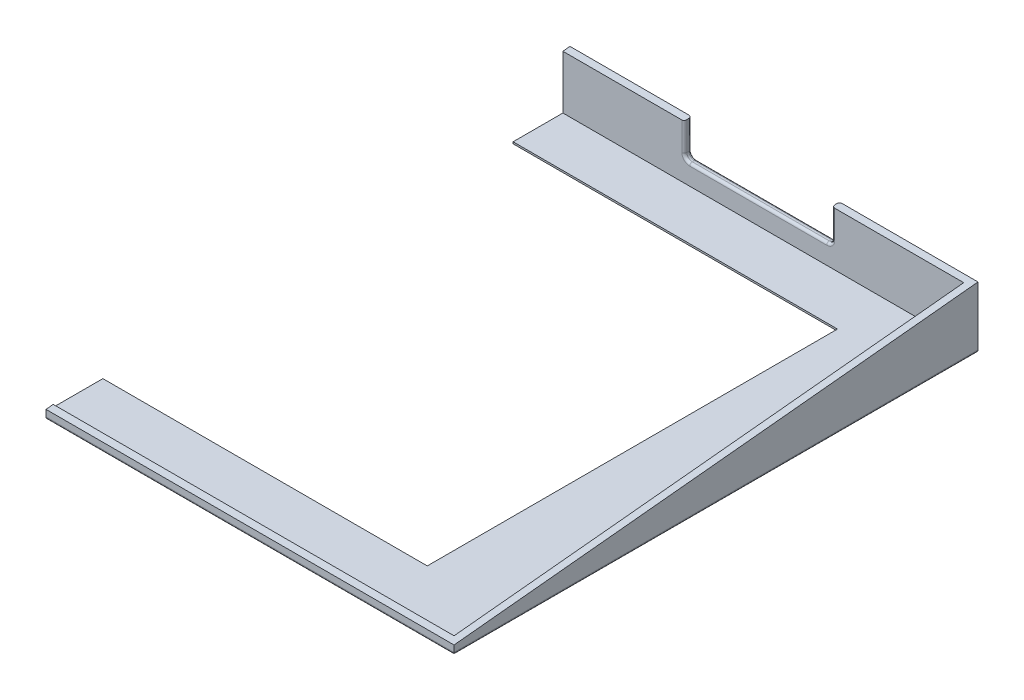
ISO-10303-21;
HEADER;
FILE_DESCRIPTION(('STEP AP214'),'2;1');
FILE_NAME('part.step','',(''),(''),'','','');
FILE_SCHEMA(('AUTOMOTIVE_DESIGN { 1 0 10303 214 1 1 1 1 }'));
ENDSEC;
DATA;
#1=APPLICATION_CONTEXT('core data for automotive mechanical design processes');
#2=APPLICATION_PROTOCOL_DEFINITION('international standard','automotive_design',2000,#1);
#3=PRODUCT_CONTEXT('',#1,'mechanical');
#4=PRODUCT('Part','Part','',(#3));
#5=PRODUCT_RELATED_PRODUCT_CATEGORY('part','',(#4));
#6=PRODUCT_DEFINITION_FORMATION('','',#4);
#7=PRODUCT_DEFINITION_CONTEXT('part definition',#1,'design');
#8=PRODUCT_DEFINITION('design','',#6,#7);
#9=PRODUCT_DEFINITION_SHAPE('','',#8);
#10=(LENGTH_UNIT() NAMED_UNIT(*) SI_UNIT(.MILLI.,.METRE.));
#11=(NAMED_UNIT(*) PLANE_ANGLE_UNIT() SI_UNIT($,.RADIAN.));
#12=(NAMED_UNIT(*) SI_UNIT($,.STERADIAN.) SOLID_ANGLE_UNIT());
#13=UNCERTAINTY_MEASURE_WITH_UNIT(LENGTH_MEASURE(1.E-05),#10,'distance_accuracy_value','');
#14=(GEOMETRIC_REPRESENTATION_CONTEXT(3) GLOBAL_UNCERTAINTY_ASSIGNED_CONTEXT((#13)) GLOBAL_UNIT_ASSIGNED_CONTEXT((#10,
#11,#12)) REPRESENTATION_CONTEXT('',''));
#15=CARTESIAN_POINT('',(0.,0.,0.));
#16=DIRECTION('',(0.,0.,1.));
#17=DIRECTION('',(1.,0.,0.));
#18=AXIS2_PLACEMENT_3D('',#15,#16,#17);
#19=CARTESIAN_POINT('',(0.,0.,0.));
#20=DIRECTION('',(1.,0.,0.));
#21=DIRECTION('',(0.,0.,-1.));
#22=AXIS2_PLACEMENT_3D('',#19,#20,#21);
#23=PLANE('',#22);
#24=DIRECTION('',(0.,-1.,0.));
#25=VECTOR('',#24,1.);
#26=CARTESIAN_POINT('',(0.,-261.583327885194,-70.7189583673774));
#27=LINE('',#26,#25);
#28=CARTESIAN_POINT('',(0.,16.8383329791763,-70.7189583673774));
#29=VERTEX_POINT('',#28);
#30=CARTESIAN_POINT('',(0.,2.,-70.7189583673774));
#31=VERTEX_POINT('',#30);
#32=EDGE_CURVE('E474',#29,#31,#27,.T.);
#33=ORIENTED_EDGE('',*,*,#32,.F.);
#34=DIRECTION('',(0.,-0.0994934181893851,0.995038220239299));
#35=VECTOR('',#34,1.);
#36=CARTESIAN_POINT('',(0.,9.67049186230395,0.966948074338153));
#37=LINE('',#36,#35);
#38=CARTESIAN_POINT('',(0.,17.0343531192115,-72.6793647422029));
#39=VERTEX_POINT('',#38);
#40=EDGE_CURVE('E470',#39,#29,#37,.T.);
#41=ORIENTED_EDGE('',*,*,#40,.F.);
#42=DIRECTION('',(0.,-1.,0.));
#43=VECTOR('',#42,1.);
#44=CARTESIAN_POINT('',(0.,0.,-72.6793647422029));
#45=LINE('',#44,#43);
#46=CARTESIAN_POINT('',(0.,0.7,-72.6793647422029));
#47=VERTEX_POINT('',#46);
#48=EDGE_CURVE('E463',#39,#47,#45,.T.);
#49=ORIENTED_EDGE('',*,*,#48,.T.);
#50=CARTESIAN_POINT('',(0.,0.7,-71.9793647422029));
#51=DIRECTION('',(1.,0.,0.));
#52=DIRECTION('',(0.,0.,-1.));
#53=AXIS2_PLACEMENT_3D('',#50,#51,#52);
#54=CIRCLE('',#53,0.7);
#55=CARTESIAN_POINT('',(0.,0.,-71.9793647422029));
#56=VERTEX_POINT('',#55);
#57=EDGE_CURVE('E97',#47,#56,#54,.F.);
#58=ORIENTED_EDGE('',*,*,#57,.T.);
#59=DIRECTION('',(0.,0.,1.));
#60=VECTOR('',#59,1.);
#61=CARTESIAN_POINT('',(0.,0.,0.));
#62=LINE('',#61,#60);
#63=CARTESIAN_POINT('',(0.,0.,-61.026216129182));
#64=VERTEX_POINT('',#63);
#65=EDGE_CURVE('E466',#56,#64,#62,.T.);
#66=ORIENTED_EDGE('',*,*,#65,.T.);
#67=DIRECTION('',(0.,-0.342020143325668,-0.939692620785909));
#68=VECTOR('',#67,1.);
#69=CARTESIAN_POINT('',(0.,0.,-61.026216129182));
#70=LINE('',#69,#68);
#71=CARTESIAN_POINT('',(0.,1.50000000000002,-56.905));
#72=VERTEX_POINT('',#71);
#73=EDGE_CURVE('E469',#64,#72,#70,.F.);
#74=ORIENTED_EDGE('',*,*,#73,.T.);
#75=DIRECTION('',(0.,1.,0.));
#76=VECTOR('',#75,1.);
#77=CARTESIAN_POINT('',(0.,2.,-56.905));
#78=LINE('',#77,#76);
#79=CARTESIAN_POINT('',(0.,2.,-56.905));
#80=VERTEX_POINT('',#79);
#81=EDGE_CURVE('E92',#72,#80,#78,.T.);
#82=ORIENTED_EDGE('',*,*,#81,.T.);
#83=DIRECTION('',(0.,0.,1.));
#84=VECTOR('',#83,1.);
#85=CARTESIAN_POINT('',(0.,2.,0.));
#86=LINE('',#85,#84);
#87=EDGE_CURVE('E478',#31,#80,#86,.T.);
#88=ORIENTED_EDGE('',*,*,#87,.F.);
#89=EDGE_LOOP('',(#33,#41,#49,#58,#66,#74,#82,#88));
#90=FACE_BOUND('',#89,.T.);
#91=ADVANCED_FACE('F89',(#90),#23,.F.);
#92=DIRECTION('',(0.,-1.,0.));
#93=VECTOR('',#92,1.);
#94=CARTESIAN_POINT('',(0.,2.,56.905));
#95=LINE('',#94,#93);
#96=CARTESIAN_POINT('',(0.,2.,56.905));
#97=VERTEX_POINT('',#96);
#98=CARTESIAN_POINT('',(0.,1.50000000000002,56.905));
#99=VERTEX_POINT('',#98);
#100=EDGE_CURVE('E475',#97,#99,#95,.T.);
#101=ORIENTED_EDGE('',*,*,#100,.T.);
#102=DIRECTION('',(0.,0.342020143325668,-0.939692620785909));
#103=VECTOR('',#102,1.);
#104=CARTESIAN_POINT('',(0.,0.,61.026216129182));
#105=LINE('',#104,#103);
#106=CARTESIAN_POINT('',(0.,0.,61.026216129182));
#107=VERTEX_POINT('',#106);
#108=EDGE_CURVE('E462',#99,#107,#105,.F.);
#109=ORIENTED_EDGE('',*,*,#108,.T.);
#110=CARTESIAN_POINT('',(0.,0.,71.9793647422029));
#111=VERTEX_POINT('',#110);
#112=EDGE_CURVE('E464',#107,#111,#62,.T.);
#113=ORIENTED_EDGE('',*,*,#112,.T.);
#114=CARTESIAN_POINT('',(0.,0.7,71.9793647422029));
#115=DIRECTION('',(1.,0.,0.));
#116=DIRECTION('',(0.,0.,-1.));
#117=AXIS2_PLACEMENT_3D('',#114,#115,#116);
#118=CIRCLE('',#117,0.7);
#119=CARTESIAN_POINT('',(0.,0.7,72.6793647422029));
#120=VERTEX_POINT('',#119);
#121=EDGE_CURVE('E12',#111,#120,#118,.F.);
#122=ORIENTED_EDGE('',*,*,#121,.T.);
#123=DIRECTION('',(0.,1.,0.));
#124=VECTOR('',#123,1.);
#125=CARTESIAN_POINT('',(0.,0.,72.6793647422029));
#126=LINE('',#125,#124);
#127=CARTESIAN_POINT('',(0.,2.5,72.6793647422029));
#128=VERTEX_POINT('',#127);
#129=EDGE_CURVE('E111',#120,#128,#126,.T.);
#130=ORIENTED_EDGE('',*,*,#129,.T.);
#131=CARTESIAN_POINT('',(0.,2.699979088573,70.6793647422029));
#132=VERTEX_POINT('',#131);
#133=EDGE_CURVE('E292',#132,#128,#37,.T.);
#134=ORIENTED_EDGE('',*,*,#133,.F.);
#135=DIRECTION('',(0.,1.,0.));
#136=VECTOR('',#135,1.);
#137=CARTESIAN_POINT('',(0.,-261.583327885194,70.6793647422029));
#138=LINE('',#137,#136);
#139=CARTESIAN_POINT('',(0.,2.,70.6793647422029));
#140=VERTEX_POINT('',#139);
#141=EDGE_CURVE('E472',#140,#132,#138,.T.);
#142=ORIENTED_EDGE('',*,*,#141,.F.);
#143=EDGE_CURVE('E480',#97,#140,#86,.T.);
#144=ORIENTED_EDGE('',*,*,#143,.F.);
#145=EDGE_LOOP('',(#101,#109,#113,#122,#130,#134,#142,#144));
#146=FACE_BOUND('',#145,.T.);
#147=ADVANCED_FACE('F499',(#146),#23,.F.);
#148=CARTESIAN_POINT('',(259.440380786187,9.67049186230395,0.966948074338153));
#149=DIRECTION('',(0.,-0.995038220239299,-0.0994934181893851));
#150=DIRECTION('',(0.,0.0994934181893851,-0.995038220239299));
#151=AXIS2_PLACEMENT_3D('',#148,#149,#150);
#152=PLANE('',#151);
#153=DIRECTION('',(-1.,0.,0.));
#154=VECTOR('',#153,1.);
#155=CARTESIAN_POINT('',(259.440380786187,17.0343531192115,-72.6793647422029));
#156=LINE('',#155,#154);
#157=CARTESIAN_POINT('',(33.0037224637248,17.0343531192115,-72.6793647422029));
#158=VERTEX_POINT('',#157);
#159=EDGE_CURVE('E293',#158,#39,#156,.T.);
#160=ORIENTED_EDGE('',*,*,#159,.T.);
#161=ORIENTED_EDGE('',*,*,#40,.T.);
#162=DIRECTION('',(-1.,0.,0.));
#163=VECTOR('',#162,1.);
#164=CARTESIAN_POINT('',(-111.243316088899,16.8383329791763,-70.7189583673774));
#165=LINE('',#164,#163);
#166=CARTESIAN_POINT('',(33.0037224637248,16.8383329791763,-70.7189583673774));
#167=VERTEX_POINT('',#166);
#168=EDGE_CURVE('E310',#167,#29,#165,.T.);
#169=ORIENTED_EDGE('',*,*,#168,.F.);
#170=CARTESIAN_POINT('',(33.0037224637248,16.9083256601769,-71.4189583673774));
#171=DIRECTION('',(0.,-0.995038220239299,-0.0994934181893851));
#172=DIRECTION('',(0.,-0.0994934181893851,0.995038220239299));
#173=AXIS2_PLACEMENT_3D('',#170,#171,#172);
#174=ELLIPSE('',#173,0.703490565248494,0.7);
#175=CARTESIAN_POINT('',(33.7037224637248,16.9083256601769,-71.4189583673774));
#176=VERTEX_POINT('',#175);
#177=EDGE_CURVE('E372',#167,#176,#174,.F.);
#178=ORIENTED_EDGE('',*,*,#177,.T.);
#179=DIRECTION('',(0.,0.0994934181893851,-0.995038220239299));
#180=VECTOR('',#179,1.);
#181=CARTESIAN_POINT('',(33.7037224637248,9.67049186230395,0.966948074338153));
#182=LINE('',#181,#180);
#183=CARTESIAN_POINT('',(33.7037224637248,16.9643604382109,-71.9793647422029));
#184=VERTEX_POINT('',#183);
#185=EDGE_CURVE('E344',#176,#184,#182,.T.);
#186=ORIENTED_EDGE('',*,*,#185,.T.);
#187=CARTESIAN_POINT('',(33.0037224637248,16.9643604382109,-71.9793647422029));
#188=DIRECTION('',(0.,-0.995038220239299,-0.0994934181893851));
#189=DIRECTION('',(0.,-0.0994934181893851,0.995038220239299));
#190=AXIS2_PLACEMENT_3D('',#187,#188,#189);
#191=ELLIPSE('',#190,0.703490565248494,0.7);
#192=EDGE_CURVE('E370',#184,#158,#191,.F.);
#193=ORIENTED_EDGE('',*,*,#192,.T.);
#194=EDGE_LOOP('',(#160,#161,#169,#178,#186,#193));
#195=FACE_BOUND('',#194,.T.);
#196=ADVANCED_FACE('F539',(#195),#152,.F.);
#197=CARTESIAN_POINT('',(0.,2.,0.));
#198=DIRECTION('',(0.,-1.,0.));
#199=DIRECTION('',(0.,0.,-1.));
#200=AXIS2_PLACEMENT_3D('',#197,#198,#199);
#201=PLANE('',#200);
#202=DIRECTION('',(-1.,0.,0.));
#203=VECTOR('',#202,1.);
#204=CARTESIAN_POINT('',(-111.243316088899,2.,-70.7189583673774));
#205=LINE('',#204,#203);
#206=CARTESIAN_POINT('',(111.203722463725,2.,-70.7189583673774));
#207=VERTEX_POINT('',#206);
#208=EDGE_CURVE('E314',#207,#31,#205,.T.);
#209=ORIENTED_EDGE('',*,*,#208,.T.);
#210=ORIENTED_EDGE('',*,*,#87,.T.);
#211=DIRECTION('',(-1.,0.,0.));
#212=VECTOR('',#211,1.);
#213=CARTESIAN_POINT('',(-90.,2.,-56.905));
#214=LINE('',#213,#212);
#215=CARTESIAN_POINT('',(90.,2.,-56.905));
#216=VERTEX_POINT('',#215);
#217=EDGE_CURVE('E330',#216,#80,#214,.T.);
#218=ORIENTED_EDGE('',*,*,#217,.F.);
#219=DIRECTION('',(0.,0.,-1.));
#220=VECTOR('',#219,1.);
#221=CARTESIAN_POINT('',(90.,2.,56.905));
#222=LINE('',#221,#220);
#223=CARTESIAN_POINT('',(90.,2.,56.905));
#224=VERTEX_POINT('',#223);
#225=EDGE_CURVE('E327',#224,#216,#222,.T.);
#226=ORIENTED_EDGE('',*,*,#225,.F.);
#227=DIRECTION('',(1.,0.,0.));
#228=VECTOR('',#227,1.);
#229=CARTESIAN_POINT('',(-90.,2.,56.905));
#230=LINE('',#229,#228);
#231=EDGE_CURVE('E333',#97,#224,#230,.T.);
#232=ORIENTED_EDGE('',*,*,#231,.F.);
#233=ORIENTED_EDGE('',*,*,#143,.T.);
#234=DIRECTION('',(1.,0.,0.));
#235=VECTOR('',#234,1.);
#236=CARTESIAN_POINT('',(-111.243316088899,2.,70.6793647422029));
#237=LINE('',#236,#235);
#238=CARTESIAN_POINT('',(111.203722463725,2.,70.6793647422029));
#239=VERTEX_POINT('',#238);
#240=EDGE_CURVE('E317',#140,#239,#237,.T.);
#241=ORIENTED_EDGE('',*,*,#240,.T.);
#242=DIRECTION('',(0.,0.,-1.));
#243=VECTOR('',#242,1.);
#244=CARTESIAN_POINT('',(111.203722463725,2.,-70.7189583673774));
#245=LINE('',#244,#243);
#246=EDGE_CURVE('E318',#239,#207,#245,.T.);
#247=ORIENTED_EDGE('',*,*,#246,.T.);
#248=EDGE_LOOP('',(#209,#210,#218,#226,#232,#233,#241,#247));
#249=FACE_BOUND('',#248,.T.);
#250=ADVANCED_FACE('F493',(#249),#201,.F.);
#251=CARTESIAN_POINT('',(0.,0.,0.));
#252=DIRECTION('',(0.,-1.,0.));
#253=DIRECTION('',(0.,0.,-1.));
#254=AXIS2_PLACEMENT_3D('',#251,#252,#253);
#255=PLANE('',#254);
#256=ORIENTED_EDGE('',*,*,#65,.F.);
#257=DIRECTION('',(-1.,0.,0.));
#258=VECTOR('',#257,1.);
#259=CARTESIAN_POINT('',(0.,0.,-71.9793647422029));
#260=LINE('',#259,#258);
#261=CARTESIAN_POINT('',(112.503722463725,0.,-71.9793647422029));
#262=VERTEX_POINT('',#261);
#263=EDGE_CURVE('E445',#56,#262,#260,.F.);
#264=ORIENTED_EDGE('',*,*,#263,.T.);
#265=DIRECTION('',(0.,0.,-1.));
#266=VECTOR('',#265,1.);
#267=CARTESIAN_POINT('',(112.503722463725,0.,0.));
#268=LINE('',#267,#266);
#269=CARTESIAN_POINT('',(112.503722463725,0.,71.9793647422029));
#270=VERTEX_POINT('',#269);
#271=EDGE_CURVE('E447',#262,#270,#268,.F.);
#272=ORIENTED_EDGE('',*,*,#271,.T.);
#273=DIRECTION('',(1.,0.,0.));
#274=VECTOR('',#273,1.);
#275=CARTESIAN_POINT('',(0.,0.,71.9793647422029));
#276=LINE('',#275,#274);
#277=EDGE_CURVE('E449',#270,#111,#276,.F.);
#278=ORIENTED_EDGE('',*,*,#277,.T.);
#279=ORIENTED_EDGE('',*,*,#112,.F.);
#280=DIRECTION('',(1.,0.,0.));
#281=VECTOR('',#280,1.);
#282=CARTESIAN_POINT('',(0.,0.,61.026216129182));
#283=LINE('',#282,#281);
#284=CARTESIAN_POINT('',(94.121216129182,0.,61.026216129182));
#285=VERTEX_POINT('',#284);
#286=EDGE_CURVE('E426',#107,#285,#283,.T.);
#287=ORIENTED_EDGE('',*,*,#286,.T.);
#288=DIRECTION('',(0.,0.,-1.));
#289=VECTOR('',#288,1.);
#290=CARTESIAN_POINT('',(94.121216129182,0.,0.));
#291=LINE('',#290,#289);
#292=CARTESIAN_POINT('',(94.121216129182,0.,-61.026216129182));
#293=VERTEX_POINT('',#292);
#294=EDGE_CURVE('E400',#285,#293,#291,.T.);
#295=ORIENTED_EDGE('',*,*,#294,.T.);
#296=DIRECTION('',(-1.,0.,0.));
#297=VECTOR('',#296,1.);
#298=CARTESIAN_POINT('',(0.,0.,-61.026216129182));
#299=LINE('',#298,#297);
#300=EDGE_CURVE('E428',#293,#64,#299,.T.);
#301=ORIENTED_EDGE('',*,*,#300,.T.);
#302=EDGE_LOOP('',(#256,#264,#272,#278,#279,#287,#295,#301));
#303=FACE_BOUND('',#302,.T.);
#304=ADVANCED_FACE('F566',(#303),#255,.T.);
#305=CARTESIAN_POINT('',(90.,2.,56.905));
#306=DIRECTION('',(-1.,0.,0.));
#307=DIRECTION('',(0.,0.,1.));
#308=AXIS2_PLACEMENT_3D('',#305,#306,#307);
#309=PLANE('',#308);
#310=DIRECTION('',(0.,-1.,0.));
#311=VECTOR('',#310,1.);
#312=CARTESIAN_POINT('',(90.,2.,-56.905));
#313=LINE('',#312,#311);
#314=CARTESIAN_POINT('',(90.,1.50000000000002,-56.905));
#315=VERTEX_POINT('',#314);
#316=EDGE_CURVE('E338',#216,#315,#313,.T.);
#317=ORIENTED_EDGE('',*,*,#316,.T.);
#318=DIRECTION('',(0.,0.,1.));
#319=VECTOR('',#318,1.);
#320=CARTESIAN_POINT('',(90.,1.50000000000002,56.905));
#321=LINE('',#320,#319);
#322=CARTESIAN_POINT('',(90.,1.50000000000002,56.905));
#323=VERTEX_POINT('',#322);
#324=EDGE_CURVE('E436',#315,#323,#321,.T.);
#325=ORIENTED_EDGE('',*,*,#324,.T.);
#326=DIRECTION('',(0.,-1.,0.));
#327=VECTOR('',#326,1.);
#328=CARTESIAN_POINT('',(90.,2.,56.905));
#329=LINE('',#328,#327);
#330=EDGE_CURVE('E335',#224,#323,#329,.T.);
#331=ORIENTED_EDGE('',*,*,#330,.F.);
#332=ORIENTED_EDGE('',*,*,#225,.T.);
#333=EDGE_LOOP('',(#317,#325,#331,#332));
#334=FACE_BOUND('',#333,.T.);
#335=ADVANCED_FACE('F551',(#334),#309,.T.);
#336=CARTESIAN_POINT('',(-90.,2.,-56.905));
#337=DIRECTION('',(0.,0.,1.));
#338=DIRECTION('',(1.,0.,0.));
#339=AXIS2_PLACEMENT_3D('',#336,#337,#338);
#340=PLANE('',#339);
#341=ORIENTED_EDGE('',*,*,#81,.F.);
#342=DIRECTION('',(1.,0.,0.));
#343=VECTOR('',#342,1.);
#344=CARTESIAN_POINT('',(-90.,1.50000000000002,-56.905));
#345=LINE('',#344,#343);
#346=EDGE_CURVE('E431',#72,#315,#345,.T.);
#347=ORIENTED_EDGE('',*,*,#346,.T.);
#348=ORIENTED_EDGE('',*,*,#316,.F.);
#349=ORIENTED_EDGE('',*,*,#217,.T.);
#350=EDGE_LOOP('',(#341,#347,#348,#349));
#351=FACE_BOUND('',#350,.T.);
#352=ADVANCED_FACE('F548',(#351),#340,.T.);
#353=CARTESIAN_POINT('',(-90.,2.,56.905));
#354=DIRECTION('',(0.,0.,-1.));
#355=DIRECTION('',(-1.,0.,0.));
#356=AXIS2_PLACEMENT_3D('',#353,#354,#355);
#357=PLANE('',#356);
#358=ORIENTED_EDGE('',*,*,#100,.F.);
#359=ORIENTED_EDGE('',*,*,#231,.T.);
#360=ORIENTED_EDGE('',*,*,#330,.T.);
#361=DIRECTION('',(-1.,0.,0.));
#362=VECTOR('',#361,1.);
#363=CARTESIAN_POINT('',(-90.,1.50000000000002,56.905));
#364=LINE('',#363,#362);
#365=EDGE_CURVE('E433',#323,#99,#364,.T.);
#366=ORIENTED_EDGE('',*,*,#365,.T.);
#367=EDGE_LOOP('',(#358,#359,#360,#366));
#368=FACE_BOUND('',#367,.T.);
#369=ADVANCED_FACE('F555',(#368),#357,.T.);
#370=CARTESIAN_POINT('',(110.203722463725,0.,-72.6793647422029));
#371=DIRECTION('',(0.,0.,-1.));
#372=DIRECTION('',(-1.,0.,0.));
#373=AXIS2_PLACEMENT_3D('',#370,#371,#372);
#374=PLANE('',#373);
#375=ORIENTED_EDGE('',*,*,#48,.F.);
#376=ORIENTED_EDGE('',*,*,#159,.F.);
#377=DIRECTION('',(0.,1.,0.));
#378=VECTOR('',#377,1.);
#379=CARTESIAN_POINT('',(33.0037224637248,9.03435311921149,-72.6793647422029));
#380=LINE('',#379,#378);
#381=CARTESIAN_POINT('',(33.0037224637248,9.03435311921149,-72.6793647422029));
#382=VERTEX_POINT('',#381);
#383=EDGE_CURVE('E394',#158,#382,#380,.F.);
#384=ORIENTED_EDGE('',*,*,#383,.T.);
#385=CARTESIAN_POINT('',(35.2037224637248,9.03435311921148,-72.6793647422029));
#386=DIRECTION('',(0.,0.,-1.));
#387=DIRECTION('',(-1.,0.,0.));
#388=AXIS2_PLACEMENT_3D('',#385,#386,#387);
#389=CIRCLE('',#388,2.2);
#390=CARTESIAN_POINT('',(35.2037224637248,6.83435311921148,-72.6793647422029));
#391=VERTEX_POINT('',#390);
#392=EDGE_CURVE('E392',#382,#391,#389,.F.);
#393=ORIENTED_EDGE('',*,*,#392,.T.);
#394=DIRECTION('',(-1.,0.,0.));
#395=VECTOR('',#394,1.);
#396=CARTESIAN_POINT('',(73.2037224637248,6.83435311921148,-72.6793647422029));
#397=LINE('',#396,#395);
#398=CARTESIAN_POINT('',(73.2037224637248,6.83435311921148,-72.6793647422029));
#399=VERTEX_POINT('',#398);
#400=EDGE_CURVE('E390',#391,#399,#397,.F.);
#401=ORIENTED_EDGE('',*,*,#400,.T.);
#402=CARTESIAN_POINT('',(73.2037224637248,9.03435311921148,-72.6793647422029));
#403=DIRECTION('',(0.,0.,-1.));
#404=DIRECTION('',(-1.,0.,0.));
#405=AXIS2_PLACEMENT_3D('',#402,#403,#404);
#406=CIRCLE('',#405,2.2);
#407=CARTESIAN_POINT('',(75.4037224637248,9.0343531192115,-72.6793647422029));
#408=VERTEX_POINT('',#407);
#409=EDGE_CURVE('E388',#399,#408,#406,.F.);
#410=ORIENTED_EDGE('',*,*,#409,.T.);
#411=DIRECTION('',(0.,-1.,0.));
#412=VECTOR('',#411,1.);
#413=CARTESIAN_POINT('',(75.4037224637248,17.0343531192115,-72.6793647422029));
#414=LINE('',#413,#412);
#415=CARTESIAN_POINT('',(75.4037224637248,17.0343531192115,-72.6793647422029));
#416=VERTEX_POINT('',#415);
#417=EDGE_CURVE('E386',#408,#416,#414,.F.);
#418=ORIENTED_EDGE('',*,*,#417,.T.);
#419=CARTESIAN_POINT('',(113.203722463725,17.0343531192115,-72.6793647422029));
#420=VERTEX_POINT('',#419);
#421=EDGE_CURVE('E306',#420,#416,#156,.T.);
#422=ORIENTED_EDGE('',*,*,#421,.F.);
#423=DIRECTION('',(0.,1.,0.));
#424=VECTOR('',#423,1.);
#425=CARTESIAN_POINT('',(113.203722463725,0.,-72.6793647422029));
#426=LINE('',#425,#424);
#427=CARTESIAN_POINT('',(113.203722463725,0.7,-72.6793647422029));
#428=VERTEX_POINT('',#427);
#429=EDGE_CURVE('E281',#428,#420,#426,.T.);
#430=ORIENTED_EDGE('',*,*,#429,.F.);
#431=DIRECTION('',(-1.,0.,0.));
#432=VECTOR('',#431,1.);
#433=CARTESIAN_POINT('',(110.203722463725,0.7,-72.6793647422029));
#434=LINE('',#433,#432);
#435=EDGE_CURVE('E454',#428,#47,#434,.T.);
#436=ORIENTED_EDGE('',*,*,#435,.T.);
#437=EDGE_LOOP('',(#375,#376,#384,#393,#401,#410,#418,#422,#430,#436));
#438=FACE_BOUND('',#437,.T.);
#439=ADVANCED_FACE('F576',(#438),#374,.T.);
#440=CARTESIAN_POINT('',(113.203722463725,0.,69.6793647422029));
#441=DIRECTION('',(1.,0.,0.));
#442=DIRECTION('',(0.,0.,-1.));
#443=AXIS2_PLACEMENT_3D('',#440,#441,#442);
#444=PLANE('',#443);
#445=DIRECTION('',(0.,1.,0.));
#446=VECTOR('',#445,1.);
#447=CARTESIAN_POINT('',(113.203722463725,0.,72.6793647422029));
#448=LINE('',#447,#446);
#449=CARTESIAN_POINT('',(113.203722463725,0.7,72.6793647422029));
#450=VERTEX_POINT('',#449);
#451=CARTESIAN_POINT('',(113.203722463725,2.5,72.6793647422029));
#452=VERTEX_POINT('',#451);
#453=EDGE_CURVE('E273',#450,#452,#448,.T.);
#454=ORIENTED_EDGE('',*,*,#453,.F.);
#455=DIRECTION('',(0.,0.,-1.));
#456=VECTOR('',#455,1.);
#457=CARTESIAN_POINT('',(113.203722463725,0.7,69.6793647422029));
#458=LINE('',#457,#456);
#459=EDGE_CURVE('E452',#450,#428,#458,.T.);
#460=ORIENTED_EDGE('',*,*,#459,.T.);
#461=ORIENTED_EDGE('',*,*,#429,.T.);
#462=DIRECTION('',(0.,-0.0994934181893851,0.995038220239299));
#463=VECTOR('',#462,1.);
#464=CARTESIAN_POINT('',(113.203722463725,9.67049186230395,0.966948074338153));
#465=LINE('',#464,#463);
#466=EDGE_CURVE('E289',#420,#452,#465,.T.);
#467=ORIENTED_EDGE('',*,*,#466,.T.);
#468=EDGE_LOOP('',(#454,#460,#461,#467));
#469=FACE_BOUND('',#468,.T.);
#470=ADVANCED_FACE('F295',(#469),#444,.T.);
#471=CARTESIAN_POINT('',(110.203722463725,0.,72.6793647422029));
#472=DIRECTION('',(0.,0.,1.));
#473=DIRECTION('',(1.,0.,0.));
#474=AXIS2_PLACEMENT_3D('',#471,#472,#473);
#475=PLANE('',#474);
#476=ORIENTED_EDGE('',*,*,#129,.F.);
#477=DIRECTION('',(1.,0.,0.));
#478=VECTOR('',#477,1.);
#479=CARTESIAN_POINT('',(110.203722463725,0.7,72.6793647422029));
#480=LINE('',#479,#478);
#481=EDGE_CURVE('E277',#120,#450,#480,.T.);
#482=ORIENTED_EDGE('',*,*,#481,.T.);
#483=ORIENTED_EDGE('',*,*,#453,.T.);
#484=DIRECTION('',(-1.,0.,0.));
#485=VECTOR('',#484,1.);
#486=CARTESIAN_POINT('',(259.440380786187,2.5,72.6793647422029));
#487=LINE('',#486,#485);
#488=EDGE_CURVE('E276',#452,#128,#487,.T.);
#489=ORIENTED_EDGE('',*,*,#488,.T.);
#490=EDGE_LOOP('',(#476,#482,#483,#489));
#491=FACE_BOUND('',#490,.T.);
#492=ADVANCED_FACE('F275',(#491),#475,.T.);
#493=CARTESIAN_POINT('',(-111.243316088899,-261.583327885194,-70.7189583673774));
#494=DIRECTION('',(0.,0.,-1.));
#495=DIRECTION('',(-1.,0.,0.));
#496=AXIS2_PLACEMENT_3D('',#493,#494,#495);
#497=PLANE('',#496);
#498=ORIENTED_EDGE('',*,*,#168,.T.);
#499=ORIENTED_EDGE('',*,*,#32,.T.);
#500=ORIENTED_EDGE('',*,*,#208,.F.);
#501=DIRECTION('',(0.,1.,0.));
#502=VECTOR('',#501,1.);
#503=CARTESIAN_POINT('',(111.203722463725,-261.583327885194,-70.7189583673774));
#504=LINE('',#503,#502);
#505=CARTESIAN_POINT('',(111.203722463725,16.8383329791763,-70.7189583673774));
#506=VERTEX_POINT('',#505);
#507=EDGE_CURVE('E282',#207,#506,#504,.T.);
#508=ORIENTED_EDGE('',*,*,#507,.T.);
#509=CARTESIAN_POINT('',(75.4037224637248,16.8383329791763,-70.7189583673774));
#510=VERTEX_POINT('',#509);
#511=EDGE_CURVE('E311',#506,#510,#165,.T.);
#512=ORIENTED_EDGE('',*,*,#511,.T.);
#513=DIRECTION('',(0.,1.,0.));
#514=VECTOR('',#513,1.);
#515=CARTESIAN_POINT('',(75.4037224637248,-261.583327885194,-70.7189583673774));
#516=LINE('',#515,#514);
#517=CARTESIAN_POINT('',(75.4037224637248,9.0343531192115,-70.7189583673774));
#518=VERTEX_POINT('',#517);
#519=EDGE_CURVE('E356',#510,#518,#516,.F.);
#520=ORIENTED_EDGE('',*,*,#519,.T.);
#521=CARTESIAN_POINT('',(73.2037224637248,9.03435311921148,-70.7189583673774));
#522=DIRECTION('',(0.,0.,-1.));
#523=DIRECTION('',(-1.,0.,0.));
#524=AXIS2_PLACEMENT_3D('',#521,#522,#523);
#525=CIRCLE('',#524,2.2);
#526=CARTESIAN_POINT('',(73.2037224637248,6.83435311921148,-70.7189583673774));
#527=VERTEX_POINT('',#526);
#528=EDGE_CURVE('E358',#518,#527,#525,.T.);
#529=ORIENTED_EDGE('',*,*,#528,.T.);
#530=DIRECTION('',(1.,0.,0.));
#531=VECTOR('',#530,1.);
#532=CARTESIAN_POINT('',(-111.243316088899,6.83435311921149,-70.7189583673774));
#533=LINE('',#532,#531);
#534=CARTESIAN_POINT('',(35.2037224637248,6.83435311921148,-70.7189583673774));
#535=VERTEX_POINT('',#534);
#536=EDGE_CURVE('E360',#527,#535,#533,.F.);
#537=ORIENTED_EDGE('',*,*,#536,.T.);
#538=CARTESIAN_POINT('',(35.2037224637248,9.03435311921148,-70.7189583673774));
#539=DIRECTION('',(0.,0.,-1.));
#540=DIRECTION('',(-1.,0.,0.));
#541=AXIS2_PLACEMENT_3D('',#538,#539,#540);
#542=CIRCLE('',#541,2.2);
#543=CARTESIAN_POINT('',(33.0037224637248,9.03435311921149,-70.7189583673774));
#544=VERTEX_POINT('',#543);
#545=EDGE_CURVE('E362',#535,#544,#542,.T.);
#546=ORIENTED_EDGE('',*,*,#545,.T.);
#547=DIRECTION('',(0.,-1.,0.));
#548=VECTOR('',#547,1.);
#549=CARTESIAN_POINT('',(33.0037224637248,-261.583327885194,-70.7189583673774));
#550=LINE('',#549,#548);
#551=EDGE_CURVE('E364',#544,#167,#550,.F.);
#552=ORIENTED_EDGE('',*,*,#551,.T.);
#553=EDGE_LOOP('',(#498,#499,#500,#508,#512,#520,#529,#537,#546,#552));
#554=FACE_BOUND('',#553,.T.);
#555=ADVANCED_FACE('F509',(#554),#497,.F.);
#556=CARTESIAN_POINT('',(-111.243316088899,-261.583327885194,70.6793647422029));
#557=DIRECTION('',(0.,0.,1.));
#558=DIRECTION('',(1.,0.,0.));
#559=AXIS2_PLACEMENT_3D('',#556,#557,#558);
#560=PLANE('',#559);
#561=ORIENTED_EDGE('',*,*,#240,.F.);
#562=ORIENTED_EDGE('',*,*,#141,.T.);
#563=DIRECTION('',(1.,0.,0.));
#564=VECTOR('',#563,1.);
#565=CARTESIAN_POINT('',(-111.243316088899,2.699979088573,70.6793647422029));
#566=LINE('',#565,#564);
#567=CARTESIAN_POINT('',(111.203722463725,2.69997908857297,70.6793647422029));
#568=VERTEX_POINT('',#567);
#569=EDGE_CURVE('E308',#132,#568,#566,.T.);
#570=ORIENTED_EDGE('',*,*,#569,.T.);
#571=DIRECTION('',(0.,1.,0.));
#572=VECTOR('',#571,1.);
#573=CARTESIAN_POINT('',(111.203722463725,-261.583327885194,70.6793647422029));
#574=LINE('',#573,#572);
#575=EDGE_CURVE('E321',#239,#568,#574,.T.);
#576=ORIENTED_EDGE('',*,*,#575,.F.);
#577=EDGE_LOOP('',(#561,#562,#570,#576));
#578=FACE_BOUND('',#577,.T.);
#579=ADVANCED_FACE('F502',(#578),#560,.F.);
#580=CARTESIAN_POINT('',(111.203722463725,-261.583327885194,-70.7189583673774));
#581=DIRECTION('',(1.,0.,0.));
#582=DIRECTION('',(0.,0.,-1.));
#583=AXIS2_PLACEMENT_3D('',#580,#581,#582);
#584=PLANE('',#583);
#585=ORIENTED_EDGE('',*,*,#575,.T.);
#586=DIRECTION('',(0.,0.0994934181893851,-0.995038220239299));
#587=VECTOR('',#586,1.);
#588=CARTESIAN_POINT('',(111.203722463725,14.0822535903524,-43.1552825001623));
#589=LINE('',#588,#587);
#590=EDGE_CURVE('E341',#568,#506,#589,.T.);
#591=ORIENTED_EDGE('',*,*,#590,.T.);
#592=ORIENTED_EDGE('',*,*,#507,.F.);
#593=ORIENTED_EDGE('',*,*,#246,.F.);
#594=EDGE_LOOP('',(#585,#591,#592,#593));
#595=FACE_BOUND('',#594,.T.);
#596=ADVANCED_FACE('F505',(#595),#584,.F.);
#597=ORIENTED_EDGE('',*,*,#569,.F.);
#598=ORIENTED_EDGE('',*,*,#133,.T.);
#599=ORIENTED_EDGE('',*,*,#488,.F.);
#600=ORIENTED_EDGE('',*,*,#466,.F.);
#601=ORIENTED_EDGE('',*,*,#421,.T.);
#602=CARTESIAN_POINT('',(75.4037224637248,16.9643604382109,-71.9793647422029));
#603=DIRECTION('',(0.,-0.995038220239299,-0.0994934181893851));
#604=DIRECTION('',(0.,0.0994934181893851,-0.995038220239299));
#605=AXIS2_PLACEMENT_3D('',#602,#603,#604);
#606=ELLIPSE('',#605,0.703490565248494,0.7);
#607=CARTESIAN_POINT('',(74.7037224637248,16.9643604382109,-71.9793647422029));
#608=VERTEX_POINT('',#607);
#609=EDGE_CURVE('E366',#416,#608,#606,.F.);
#610=ORIENTED_EDGE('',*,*,#609,.T.);
#611=DIRECTION('',(0.,-0.0994934181893851,0.995038220239299));
#612=VECTOR('',#611,1.);
#613=CARTESIAN_POINT('',(74.7037224637248,9.67049186230395,0.966948074338153));
#614=LINE('',#613,#612);
#615=CARTESIAN_POINT('',(74.7037224637248,16.9083256601769,-71.4189583673774));
#616=VERTEX_POINT('',#615);
#617=EDGE_CURVE('E347',#608,#616,#614,.T.);
#618=ORIENTED_EDGE('',*,*,#617,.T.);
#619=CARTESIAN_POINT('',(75.4037224637248,16.9083256601769,-71.4189583673774));
#620=DIRECTION('',(0.,-0.995038220239299,-0.0994934181893851));
#621=DIRECTION('',(0.,0.0994934181893851,-0.995038220239299));
#622=AXIS2_PLACEMENT_3D('',#619,#620,#621);
#623=ELLIPSE('',#622,0.703490565248494,0.7);
#624=EDGE_CURVE('E368',#616,#510,#623,.F.);
#625=ORIENTED_EDGE('',*,*,#624,.T.);
#626=ORIENTED_EDGE('',*,*,#511,.F.);
#627=ORIENTED_EDGE('',*,*,#590,.F.);
#628=EDGE_LOOP('',(#597,#598,#599,#600,#601,#610,#618,#625,#626,#627));
#629=FACE_BOUND('',#628,.T.);
#630=ADVANCED_FACE('F287',(#629),#152,.F.);
#631=CARTESIAN_POINT('',(74.7037224637248,0.,-28.6327373443395));
#632=DIRECTION('',(1.,0.,0.));
#633=DIRECTION('',(0.,0.,-1.));
#634=AXIS2_PLACEMENT_3D('',#631,#632,#633);
#635=PLANE('',#634);
#636=DIRECTION('',(0.,0.,-1.));
#637=VECTOR('',#636,1.);
#638=CARTESIAN_POINT('',(74.7037224637248,9.03435311921149,-28.6327373443395));
#639=LINE('',#638,#637);
#640=CARTESIAN_POINT('',(74.7037224637248,9.03435311921149,-71.4189583673774));
#641=VERTEX_POINT('',#640);
#642=CARTESIAN_POINT('',(74.7037224637248,9.03435311921149,-71.9793647422029));
#643=VERTEX_POINT('',#642);
#644=EDGE_CURVE('E303',#641,#643,#639,.T.);
#645=ORIENTED_EDGE('',*,*,#644,.F.);
#646=DIRECTION('',(0.,1.,0.));
#647=VECTOR('',#646,1.);
#648=CARTESIAN_POINT('',(74.7037224637248,0.,-71.4189583673774));
#649=LINE('',#648,#647);
#650=EDGE_CURVE('E398',#641,#616,#649,.T.);
#651=ORIENTED_EDGE('',*,*,#650,.T.);
#652=ORIENTED_EDGE('',*,*,#617,.F.);
#653=DIRECTION('',(0.,-1.,0.));
#654=VECTOR('',#653,1.);
#655=CARTESIAN_POINT('',(74.7037224637248,9.03435311921149,-71.9793647422029));
#656=LINE('',#655,#654);
#657=EDGE_CURVE('E396',#608,#643,#656,.T.);
#658=ORIENTED_EDGE('',*,*,#657,.T.);
#659=EDGE_LOOP('',(#645,#651,#652,#658));
#660=FACE_BOUND('',#659,.T.);
#661=ADVANCED_FACE('F608',(#660),#635,.F.);
#662=CARTESIAN_POINT('',(33.7037224637248,0.,-28.6327373443395));
#663=DIRECTION('',(-1.,0.,0.));
#664=DIRECTION('',(0.,0.,1.));
#665=AXIS2_PLACEMENT_3D('',#662,#663,#664);
#666=PLANE('',#665);
#667=ORIENTED_EDGE('',*,*,#185,.F.);
#668=DIRECTION('',(0.,-1.,0.));
#669=VECTOR('',#668,1.);
#670=CARTESIAN_POINT('',(33.7037224637248,0.,-71.4189583673774));
#671=LINE('',#670,#669);
#672=CARTESIAN_POINT('',(33.7037224637248,9.03435311921149,-71.4189583673774));
#673=VERTEX_POINT('',#672);
#674=EDGE_CURVE('E353',#176,#673,#671,.T.);
#675=ORIENTED_EDGE('',*,*,#674,.T.);
#676=DIRECTION('',(0.,0.,-1.));
#677=VECTOR('',#676,1.);
#678=CARTESIAN_POINT('',(33.7037224637248,9.03435311921149,-28.6327373443395));
#679=LINE('',#678,#677);
#680=CARTESIAN_POINT('',(33.7037224637248,9.03435311921149,-71.9793647422029));
#681=VERTEX_POINT('',#680);
#682=EDGE_CURVE('E297',#673,#681,#679,.T.);
#683=ORIENTED_EDGE('',*,*,#682,.T.);
#684=DIRECTION('',(0.,1.,0.));
#685=VECTOR('',#684,1.);
#686=CARTESIAN_POINT('',(33.7037224637248,17.0343531192115,-71.9793647422029));
#687=LINE('',#686,#685);
#688=EDGE_CURVE('E350',#681,#184,#687,.T.);
#689=ORIENTED_EDGE('',*,*,#688,.T.);
#690=EDGE_LOOP('',(#667,#675,#683,#689));
#691=FACE_BOUND('',#690,.T.);
#692=ADVANCED_FACE('F709',(#691),#666,.F.);
#693=CARTESIAN_POINT('',(35.2037224637248,9.03435311921148,-28.6327373443395));
#694=DIRECTION('',(0.,0.,-1.));
#695=DIRECTION('',(-1.,0.,0.));
#696=AXIS2_PLACEMENT_3D('',#693,#694,#695);
#697=CYLINDRICAL_SURFACE('',#696,1.5);
#698=ORIENTED_EDGE('',*,*,#682,.F.);
#699=CARTESIAN_POINT('',(35.2037224637248,9.03435311921148,-71.4189583673774));
#700=DIRECTION('',(0.,0.,-1.));
#701=DIRECTION('',(-1.,0.,0.));
#702=AXIS2_PLACEMENT_3D('',#699,#700,#701);
#703=CIRCLE('',#702,1.5);
#704=CARTESIAN_POINT('',(35.2037224637248,7.53435311921148,-71.4189583673774));
#705=VERTEX_POINT('',#704);
#706=EDGE_CURVE('E376',#673,#705,#703,.F.);
#707=ORIENTED_EDGE('',*,*,#706,.T.);
#708=DIRECTION('',(0.,0.,-1.));
#709=VECTOR('',#708,1.);
#710=CARTESIAN_POINT('',(35.2037224637248,7.53435311921148,-28.6327373443395));
#711=LINE('',#710,#709);
#712=CARTESIAN_POINT('',(35.2037224637248,7.53435311921148,-71.9793647422029));
#713=VERTEX_POINT('',#712);
#714=EDGE_CURVE('E300',#705,#713,#711,.T.);
#715=ORIENTED_EDGE('',*,*,#714,.T.);
#716=CARTESIAN_POINT('',(35.2037224637248,9.03435311921148,-71.9793647422029));
#717=DIRECTION('',(0.,0.,-1.));
#718=DIRECTION('',(-1.,0.,0.));
#719=AXIS2_PLACEMENT_3D('',#716,#717,#718);
#720=CIRCLE('',#719,1.5);
#721=EDGE_CURVE('E374',#713,#681,#720,.T.);
#722=ORIENTED_EDGE('',*,*,#721,.T.);
#723=EDGE_LOOP('',(#698,#707,#715,#722));
#724=FACE_BOUND('',#723,.T.);
#725=ADVANCED_FACE('F620',(#724),#697,.F.);
#726=CARTESIAN_POINT('',(0.,7.53435311921148,-28.6327373443395));
#727=DIRECTION('',(0.,-1.,0.));
#728=DIRECTION('',(0.,0.,-1.));
#729=AXIS2_PLACEMENT_3D('',#726,#727,#728);
#730=PLANE('',#729);
#731=ORIENTED_EDGE('',*,*,#714,.F.);
#732=DIRECTION('',(1.,0.,0.));
#733=VECTOR('',#732,1.);
#734=CARTESIAN_POINT('',(0.,7.53435311921148,-71.4189583673774));
#735=LINE('',#734,#733);
#736=CARTESIAN_POINT('',(73.2037224637248,7.53435311921148,-71.4189583673774));
#737=VERTEX_POINT('',#736);
#738=EDGE_CURVE('E380',#705,#737,#735,.T.);
#739=ORIENTED_EDGE('',*,*,#738,.T.);
#740=DIRECTION('',(0.,0.,-1.));
#741=VECTOR('',#740,1.);
#742=CARTESIAN_POINT('',(73.2037224637248,7.53435311921148,-28.6327373443395));
#743=LINE('',#742,#741);
#744=CARTESIAN_POINT('',(73.2037224637248,7.53435311921148,-71.9793647422029));
#745=VERTEX_POINT('',#744);
#746=EDGE_CURVE('E611',#737,#745,#743,.T.);
#747=ORIENTED_EDGE('',*,*,#746,.T.);
#748=DIRECTION('',(-1.,0.,0.));
#749=VECTOR('',#748,1.);
#750=CARTESIAN_POINT('',(35.2037224637248,7.53435311921148,-71.9793647422029));
#751=LINE('',#750,#749);
#752=EDGE_CURVE('E378',#745,#713,#751,.T.);
#753=ORIENTED_EDGE('',*,*,#752,.T.);
#754=EDGE_LOOP('',(#731,#739,#747,#753));
#755=FACE_BOUND('',#754,.T.);
#756=ADVANCED_FACE('F621',(#755),#730,.F.);
#757=CARTESIAN_POINT('',(73.2037224637248,9.03435311921148,-28.6327373443395));
#758=DIRECTION('',(0.,0.,-1.));
#759=DIRECTION('',(-1.,0.,0.));
#760=AXIS2_PLACEMENT_3D('',#757,#758,#759);
#761=CYLINDRICAL_SURFACE('',#760,1.5);
#762=ORIENTED_EDGE('',*,*,#746,.F.);
#763=CARTESIAN_POINT('',(73.2037224637248,9.03435311921148,-71.4189583673774));
#764=DIRECTION('',(0.,0.,-1.));
#765=DIRECTION('',(-1.,0.,0.));
#766=AXIS2_PLACEMENT_3D('',#763,#764,#765);
#767=CIRCLE('',#766,1.5);
#768=EDGE_CURVE('E384',#737,#641,#767,.F.);
#769=ORIENTED_EDGE('',*,*,#768,.T.);
#770=ORIENTED_EDGE('',*,*,#644,.T.);
#771=CARTESIAN_POINT('',(73.2037224637248,9.03435311921148,-71.9793647422029));
#772=DIRECTION('',(0.,0.,-1.));
#773=DIRECTION('',(-1.,0.,0.));
#774=AXIS2_PLACEMENT_3D('',#771,#772,#773);
#775=CIRCLE('',#774,1.5);
#776=EDGE_CURVE('E382',#643,#745,#775,.T.);
#777=ORIENTED_EDGE('',*,*,#776,.T.);
#778=EDGE_LOOP('',(#762,#769,#770,#777));
#779=FACE_BOUND('',#778,.T.);
#780=ADVANCED_FACE('F622',(#779),#761,.F.);
#781=CARTESIAN_POINT('',(75.4037224637248,0.,-71.4189583673774));
#782=DIRECTION('',(0.,1.,0.));
#783=DIRECTION('',(0.,0.,1.));
#784=AXIS2_PLACEMENT_3D('',#781,#782,#783);
#785=CYLINDRICAL_SURFACE('',#784,0.7);
#786=ORIENTED_EDGE('',*,*,#624,.F.);
#787=ORIENTED_EDGE('',*,*,#650,.F.);
#788=CARTESIAN_POINT('',(75.4037224637248,9.0343531192115,-71.4189583673774));
#789=DIRECTION('',(0.,-1.,0.));
#790=DIRECTION('',(1.,0.,0.));
#791=AXIS2_PLACEMENT_3D('',#788,#789,#790);
#792=CIRCLE('',#791,0.7);
#793=EDGE_CURVE('E410',#518,#641,#792,.T.);
#794=ORIENTED_EDGE('',*,*,#793,.F.);
#795=ORIENTED_EDGE('',*,*,#519,.F.);
#796=EDGE_LOOP('',(#786,#787,#794,#795));
#797=FACE_BOUND('',#796,.T.);
#798=ADVANCED_FACE('F514',(#797),#785,.T.);
#799=CARTESIAN_POINT('',(73.2037224637248,9.03435311921148,-71.4189583673774));
#800=DIRECTION('',(0.,0.,-1.));
#801=DIRECTION('',(-1.,0.,0.));
#802=AXIS2_PLACEMENT_3D('',#799,#800,#801);
#803=TOROIDAL_SURFACE('',#802,2.2,0.7);
#804=ORIENTED_EDGE('',*,*,#793,.T.);
#805=ORIENTED_EDGE('',*,*,#768,.F.);
#806=CARTESIAN_POINT('',(73.2037224637248,6.83435311921148,-71.4189583673774));
#807=DIRECTION('',(-1.,0.,0.));
#808=DIRECTION('',(0.,0.,1.));
#809=AXIS2_PLACEMENT_3D('',#806,#807,#808);
#810=CIRCLE('',#809,0.7);
#811=EDGE_CURVE('E407',#527,#737,#810,.T.);
#812=ORIENTED_EDGE('',*,*,#811,.F.);
#813=ORIENTED_EDGE('',*,*,#528,.F.);
#814=EDGE_LOOP('',(#804,#805,#812,#813));
#815=FACE_BOUND('',#814,.T.);
#816=ADVANCED_FACE('F520',(#815),#803,.T.);
#817=CARTESIAN_POINT('',(0.,6.83435311921148,-71.4189583673774));
#818=DIRECTION('',(1.,0.,0.));
#819=DIRECTION('',(0.,0.,-1.));
#820=AXIS2_PLACEMENT_3D('',#817,#818,#819);
#821=CYLINDRICAL_SURFACE('',#820,0.7);
#822=ORIENTED_EDGE('',*,*,#811,.T.);
#823=ORIENTED_EDGE('',*,*,#738,.F.);
#824=CARTESIAN_POINT('',(35.2037224637248,6.83435311921148,-71.4189583673774));
#825=DIRECTION('',(-1.,0.,0.));
#826=DIRECTION('',(0.,0.,1.));
#827=AXIS2_PLACEMENT_3D('',#824,#825,#826);
#828=CIRCLE('',#827,0.7);
#829=EDGE_CURVE('E403',#535,#705,#828,.T.);
#830=ORIENTED_EDGE('',*,*,#829,.F.);
#831=ORIENTED_EDGE('',*,*,#536,.F.);
#832=EDGE_LOOP('',(#822,#823,#830,#831));
#833=FACE_BOUND('',#832,.T.);
#834=ADVANCED_FACE('F527',(#833),#821,.T.);
#835=CARTESIAN_POINT('',(35.2037224637248,9.03435311921148,-71.4189583673774));
#836=DIRECTION('',(0.,0.,-1.));
#837=DIRECTION('',(-1.,0.,0.));
#838=AXIS2_PLACEMENT_3D('',#835,#836,#837);
#839=TOROIDAL_SURFACE('',#838,2.2,0.7);
#840=ORIENTED_EDGE('',*,*,#829,.T.);
#841=ORIENTED_EDGE('',*,*,#706,.F.);
#842=CARTESIAN_POINT('',(33.0037224637248,9.03435311921149,-71.4189583673774));
#843=DIRECTION('',(0.,1.,0.));
#844=DIRECTION('',(0.,0.,1.));
#845=AXIS2_PLACEMENT_3D('',#842,#843,#844);
#846=CIRCLE('',#845,0.7);
#847=EDGE_CURVE('E401',#544,#673,#846,.T.);
#848=ORIENTED_EDGE('',*,*,#847,.F.);
#849=ORIENTED_EDGE('',*,*,#545,.F.);
#850=EDGE_LOOP('',(#840,#841,#848,#849));
#851=FACE_BOUND('',#850,.T.);
#852=ADVANCED_FACE('F531',(#851),#839,.T.);
#853=CARTESIAN_POINT('',(33.0037224637248,0.,-71.4189583673774));
#854=DIRECTION('',(0.,-1.,0.));
#855=DIRECTION('',(0.,0.,-1.));
#856=AXIS2_PLACEMENT_3D('',#853,#854,#855);
#857=CYLINDRICAL_SURFACE('',#856,0.7);
#858=ORIENTED_EDGE('',*,*,#177,.F.);
#859=ORIENTED_EDGE('',*,*,#551,.F.);
#860=ORIENTED_EDGE('',*,*,#847,.T.);
#861=ORIENTED_EDGE('',*,*,#674,.F.);
#862=EDGE_LOOP('',(#858,#859,#860,#861));
#863=FACE_BOUND('',#862,.T.);
#864=ADVANCED_FACE('F535',(#863),#857,.T.);
#865=CARTESIAN_POINT('',(75.4037224637248,0.,-71.9793647422029));
#866=DIRECTION('',(0.,1.,0.));
#867=DIRECTION('',(0.,0.,1.));
#868=AXIS2_PLACEMENT_3D('',#865,#866,#867);
#869=CYLINDRICAL_SURFACE('',#868,0.7);
#870=ORIENTED_EDGE('',*,*,#609,.F.);
#871=ORIENTED_EDGE('',*,*,#417,.F.);
#872=CARTESIAN_POINT('',(75.4037224637248,9.03435311921149,-71.9793647422029));
#873=DIRECTION('',(0.,-1.,0.));
#874=DIRECTION('',(0.,0.,-1.));
#875=AXIS2_PLACEMENT_3D('',#872,#873,#874);
#876=CIRCLE('',#875,0.7);
#877=EDGE_CURVE('E404',#643,#408,#876,.T.);
#878=ORIENTED_EDGE('',*,*,#877,.F.);
#879=ORIENTED_EDGE('',*,*,#657,.F.);
#880=EDGE_LOOP('',(#870,#871,#878,#879));
#881=FACE_BOUND('',#880,.T.);
#882=ADVANCED_FACE('F603',(#881),#869,.T.);
#883=CARTESIAN_POINT('',(73.2037224637248,9.03435311921148,-71.9793647422029));
#884=DIRECTION('',(0.,0.,-1.));
#885=DIRECTION('',(-1.,0.,0.));
#886=AXIS2_PLACEMENT_3D('',#883,#884,#885);
#887=TOROIDAL_SURFACE('',#886,2.2,0.7);
#888=ORIENTED_EDGE('',*,*,#877,.T.);
#889=ORIENTED_EDGE('',*,*,#409,.F.);
#890=CARTESIAN_POINT('',(73.2037224637248,6.83435311921148,-71.9793647422029));
#891=DIRECTION('',(-1.,0.,0.));
#892=DIRECTION('',(0.,0.,1.));
#893=AXIS2_PLACEMENT_3D('',#890,#891,#892);
#894=CIRCLE('',#893,0.7);
#895=EDGE_CURVE('E420',#745,#399,#894,.T.);
#896=ORIENTED_EDGE('',*,*,#895,.F.);
#897=ORIENTED_EDGE('',*,*,#776,.F.);
#898=EDGE_LOOP('',(#888,#889,#896,#897));
#899=FACE_BOUND('',#898,.T.);
#900=ADVANCED_FACE('F598',(#899),#887,.T.);
#901=CARTESIAN_POINT('',(0.,6.83435311921148,-71.9793647422029));
#902=DIRECTION('',(1.,0.,0.));
#903=DIRECTION('',(0.,0.,-1.));
#904=AXIS2_PLACEMENT_3D('',#901,#902,#903);
#905=CYLINDRICAL_SURFACE('',#904,0.7);
#906=ORIENTED_EDGE('',*,*,#895,.T.);
#907=ORIENTED_EDGE('',*,*,#400,.F.);
#908=CARTESIAN_POINT('',(35.2037224637248,6.83435311921148,-71.9793647422029));
#909=DIRECTION('',(-1.,0.,0.));
#910=DIRECTION('',(0.,0.,1.));
#911=AXIS2_PLACEMENT_3D('',#908,#909,#910);
#912=CIRCLE('',#911,0.7);
#913=EDGE_CURVE('E416',#713,#391,#912,.T.);
#914=ORIENTED_EDGE('',*,*,#913,.F.);
#915=ORIENTED_EDGE('',*,*,#752,.F.);
#916=EDGE_LOOP('',(#906,#907,#914,#915));
#917=FACE_BOUND('',#916,.T.);
#918=ADVANCED_FACE('F593',(#917),#905,.T.);
#919=CARTESIAN_POINT('',(35.2037224637248,9.03435311921148,-71.9793647422029));
#920=DIRECTION('',(0.,0.,-1.));
#921=DIRECTION('',(-1.,0.,0.));
#922=AXIS2_PLACEMENT_3D('',#919,#920,#921);
#923=TOROIDAL_SURFACE('',#922,2.2,0.7);
#924=ORIENTED_EDGE('',*,*,#913,.T.);
#925=ORIENTED_EDGE('',*,*,#392,.F.);
#926=CARTESIAN_POINT('',(33.0037224637248,9.0343531192115,-71.9793647422029));
#927=DIRECTION('',(0.,1.,0.));
#928=DIRECTION('',(-1.,0.,0.));
#929=AXIS2_PLACEMENT_3D('',#926,#927,#928);
#930=CIRCLE('',#929,0.7);
#931=EDGE_CURVE('E413',#681,#382,#930,.T.);
#932=ORIENTED_EDGE('',*,*,#931,.F.);
#933=ORIENTED_EDGE('',*,*,#721,.F.);
#934=EDGE_LOOP('',(#924,#925,#932,#933));
#935=FACE_BOUND('',#934,.T.);
#936=ADVANCED_FACE('F588',(#935),#923,.T.);
#937=CARTESIAN_POINT('',(33.0037224637248,0.,-71.9793647422029));
#938=DIRECTION('',(0.,-1.,0.));
#939=DIRECTION('',(0.,0.,-1.));
#940=AXIS2_PLACEMENT_3D('',#937,#938,#939);
#941=CYLINDRICAL_SURFACE('',#940,0.7);
#942=ORIENTED_EDGE('',*,*,#931,.T.);
#943=ORIENTED_EDGE('',*,*,#383,.F.);
#944=ORIENTED_EDGE('',*,*,#192,.F.);
#945=ORIENTED_EDGE('',*,*,#688,.F.);
#946=EDGE_LOOP('',(#942,#943,#944,#945));
#947=FACE_BOUND('',#946,.T.);
#948=ADVANCED_FACE('F583',(#947),#941,.T.);
#949=CARTESIAN_POINT('',(0.,0.,61.026216129182));
#950=DIRECTION('',(0.,0.939692620785909,0.342020143325668));
#951=DIRECTION('',(1.,0.,0.));
#952=AXIS2_PLACEMENT_3D('',#949,#950,#951);
#953=PLANE('',#952);
#954=ORIENTED_EDGE('',*,*,#108,.F.);
#955=ORIENTED_EDGE('',*,*,#365,.F.);
#956=DIRECTION('',(-0.684791078771736,0.249243569363954,-0.684791078771736));
#957=VECTOR('',#956,1.);
#958=CARTESIAN_POINT('',(49.984123953265,16.0645877790974,16.889123953265));
#959=LINE('',#958,#957);
#960=EDGE_CURVE('E417',#285,#323,#959,.T.);
#961=ORIENTED_EDGE('',*,*,#960,.F.);
#962=ORIENTED_EDGE('',*,*,#286,.F.);
#963=EDGE_LOOP('',(#954,#955,#961,#962));
#964=FACE_BOUND('',#963,.T.);
#965=ADVANCED_FACE('F558',(#964),#953,.F.);
#966=CARTESIAN_POINT('',(94.121216129182,0.,0.));
#967=DIRECTION('',(0.342020143325668,0.939692620785909,0.));
#968=DIRECTION('',(0.,0.,-1.));
#969=AXIS2_PLACEMENT_3D('',#966,#967,#968);
#970=PLANE('',#969);
#971=ORIENTED_EDGE('',*,*,#960,.T.);
#972=ORIENTED_EDGE('',*,*,#324,.F.);
#973=DIRECTION('',(0.684791078771736,-0.249243569363954,-0.684791078771736));
#974=VECTOR('',#973,1.);
#975=CARTESIAN_POINT('',(49.984123953265,16.0645877790974,-16.889123953265));
#976=LINE('',#975,#974);
#977=EDGE_CURVE('E438',#293,#315,#976,.F.);
#978=ORIENTED_EDGE('',*,*,#977,.F.);
#979=ORIENTED_EDGE('',*,*,#294,.F.);
#980=EDGE_LOOP('',(#971,#972,#978,#979));
#981=FACE_BOUND('',#980,.T.);
#982=ADVANCED_FACE('F562',(#981),#970,.F.);
#983=CARTESIAN_POINT('',(0.,0.,-61.026216129182));
#984=DIRECTION('',(0.,0.939692620785909,-0.342020143325668));
#985=DIRECTION('',(-1.,0.,0.));
#986=AXIS2_PLACEMENT_3D('',#983,#984,#985);
#987=PLANE('',#986);
#988=ORIENTED_EDGE('',*,*,#73,.F.);
#989=ORIENTED_EDGE('',*,*,#300,.F.);
#990=ORIENTED_EDGE('',*,*,#977,.T.);
#991=ORIENTED_EDGE('',*,*,#346,.F.);
#992=EDGE_LOOP('',(#988,#989,#990,#991));
#993=FACE_BOUND('',#992,.T.);
#994=ADVANCED_FACE('F650',(#993),#987,.F.);
#995=CARTESIAN_POINT('',(110.203722463725,0.7,-71.9793647422029));
#996=DIRECTION('',(-1.,0.,0.));
#997=DIRECTION('',(0.,0.,1.));
#998=AXIS2_PLACEMENT_3D('',#995,#996,#997);
#999=CYLINDRICAL_SURFACE('',#998,0.7);
#1000=ORIENTED_EDGE('',*,*,#57,.F.);
#1001=ORIENTED_EDGE('',*,*,#435,.F.);
#1002=CARTESIAN_POINT('',(112.503722463725,0.7,-71.9793647422029));
#1003=DIRECTION('',(-0.707106781186547,0.,-0.707106781186547));
#1004=DIRECTION('',(-0.707106781186547,0.,0.707106781186547));
#1005=AXIS2_PLACEMENT_3D('',#1002,#1003,#1004);
#1006=ELLIPSE('',#1005,0.989949493661166,0.7);
#1007=EDGE_CURVE('E441',#262,#428,#1006,.F.);
#1008=ORIENTED_EDGE('',*,*,#1007,.F.);
#1009=ORIENTED_EDGE('',*,*,#263,.F.);
#1010=EDGE_LOOP('',(#1000,#1001,#1008,#1009));
#1011=FACE_BOUND('',#1010,.T.);
#1012=ADVANCED_FACE('F578',(#1011),#999,.T.);
#1013=CARTESIAN_POINT('',(112.503722463725,0.7,69.6793647422029));
#1014=DIRECTION('',(0.,0.,-1.));
#1015=DIRECTION('',(-1.,0.,0.));
#1016=AXIS2_PLACEMENT_3D('',#1013,#1014,#1015);
#1017=CYLINDRICAL_SURFACE('',#1016,0.7);
#1018=ORIENTED_EDGE('',*,*,#1007,.T.);
#1019=ORIENTED_EDGE('',*,*,#459,.F.);
#1020=CARTESIAN_POINT('',(112.503722463725,0.7,71.9793647422029));
#1021=DIRECTION('',(0.707106781186547,0.,-0.707106781186547));
#1022=DIRECTION('',(-0.707106781186547,0.,-0.707106781186547));
#1023=AXIS2_PLACEMENT_3D('',#1020,#1021,#1022);
#1024=ELLIPSE('',#1023,0.989949493661166,0.7);
#1025=EDGE_CURVE('E457',#270,#450,#1024,.F.);
#1026=ORIENTED_EDGE('',*,*,#1025,.F.);
#1027=ORIENTED_EDGE('',*,*,#271,.F.);
#1028=EDGE_LOOP('',(#1018,#1019,#1026,#1027));
#1029=FACE_BOUND('',#1028,.T.);
#1030=ADVANCED_FACE('F572',(#1029),#1017,.T.);
#1031=CARTESIAN_POINT('',(110.203722463725,0.7,71.9793647422029));
#1032=DIRECTION('',(1.,0.,0.));
#1033=DIRECTION('',(0.,0.,-1.));
#1034=AXIS2_PLACEMENT_3D('',#1031,#1032,#1033);
#1035=CYLINDRICAL_SURFACE('',#1034,0.7);
#1036=ORIENTED_EDGE('',*,*,#121,.F.);
#1037=ORIENTED_EDGE('',*,*,#277,.F.);
#1038=ORIENTED_EDGE('',*,*,#1025,.T.);
#1039=ORIENTED_EDGE('',*,*,#481,.F.);
#1040=EDGE_LOOP('',(#1036,#1037,#1038,#1039));
#1041=FACE_BOUND('',#1040,.T.);
#1042=ADVANCED_FACE('F567',(#1041),#1035,.T.);
#1043=CLOSED_SHELL('',(#91,#147,#196,#250,#304,#335,#352,#369,#439,#470,#492,#555,#579,#596,
#630,#661,#692,#725,#756,#780,#798,#816,#834,#852,#864,#882,#900,#918,#936,#948,#965,#982,#994,
#1012,#1030,#1042));
#1044=MANIFOLD_SOLID_BREP('B2',#1043);
#1045=ADVANCED_BREP_SHAPE_REPRESENTATION('',(#18,#1044),#14);
#1046=SHAPE_DEFINITION_REPRESENTATION(#9,#1045);
ENDSEC;
END-ISO-10303-21;
